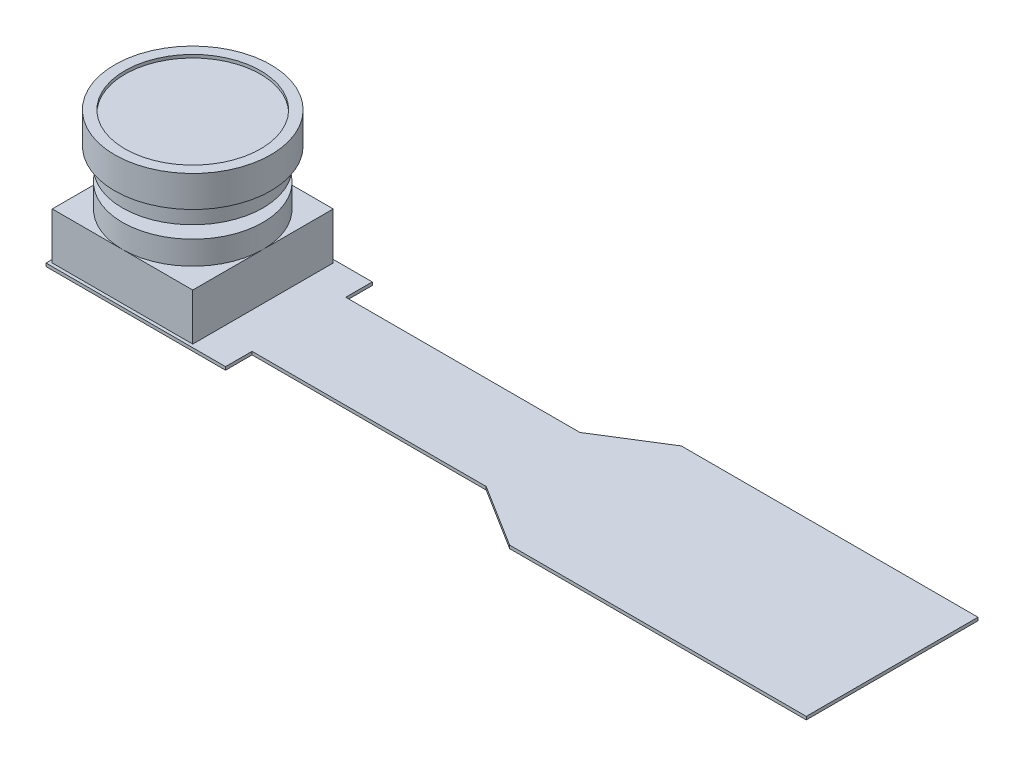
ISO-10303-21;
HEADER;
FILE_DESCRIPTION(('STEP AP214'),'2;1');
FILE_NAME('part.step','',(''),(''),'','','');
FILE_SCHEMA(('AUTOMOTIVE_DESIGN { 1 0 10303 214 1 1 1 1 }'));
ENDSEC;
DATA;
#1=APPLICATION_CONTEXT('core data for automotive mechanical design processes');
#2=APPLICATION_PROTOCOL_DEFINITION('international standard','automotive_design',2000,#1);
#3=PRODUCT_CONTEXT('',#1,'mechanical');
#4=PRODUCT('Part','Part','',(#3));
#5=PRODUCT_RELATED_PRODUCT_CATEGORY('part','',(#4));
#6=PRODUCT_DEFINITION_FORMATION('','',#4);
#7=PRODUCT_DEFINITION_CONTEXT('part definition',#1,'design');
#8=PRODUCT_DEFINITION('design','',#6,#7);
#9=PRODUCT_DEFINITION_SHAPE('','',#8);
#10=(LENGTH_UNIT() NAMED_UNIT(*) SI_UNIT(.MILLI.,.METRE.));
#11=(NAMED_UNIT(*) PLANE_ANGLE_UNIT() SI_UNIT($,.RADIAN.));
#12=(NAMED_UNIT(*) SI_UNIT($,.STERADIAN.) SOLID_ANGLE_UNIT());
#13=UNCERTAINTY_MEASURE_WITH_UNIT(LENGTH_MEASURE(1.E-05),#10,'distance_accuracy_value','');
#14=(GEOMETRIC_REPRESENTATION_CONTEXT(3) GLOBAL_UNCERTAINTY_ASSIGNED_CONTEXT((#13)) GLOBAL_UNIT_ASSIGNED_CONTEXT((#10,
#11,#12)) REPRESENTATION_CONTEXT('',''));
#15=CARTESIAN_POINT('',(0.,0.,0.));
#16=DIRECTION('',(0.,0.,1.));
#17=DIRECTION('',(1.,0.,0.));
#18=AXIS2_PLACEMENT_3D('',#15,#16,#17);
#19=CARTESIAN_POINT('',(0.,3.,0.));
#20=DIRECTION('',(0.,1.,0.));
#21=DIRECTION('',(0.,0.,1.));
#22=AXIS2_PLACEMENT_3D('',#19,#20,#21);
#23=PLANE('',#22);
#24=CARTESIAN_POINT('',(0.,3.,0.));
#25=DIRECTION('',(0.,1.,0.));
#26=DIRECTION('',(0.,0.,1.));
#27=AXIS2_PLACEMENT_3D('',#24,#25,#26);
#28=CIRCLE('',#27,4.5);
#29=CARTESIAN_POINT('',(0.,3.,4.5));
#30=VERTEX_POINT('',#29);
#31=CARTESIAN_POINT('',(4.5,3.,0.));
#32=VERTEX_POINT('',#31);
#33=EDGE_CURVE('E213',#30,#32,#28,.T.);
#34=ORIENTED_EDGE('',*,*,#33,.F.);
#35=DIRECTION('',(1.,0.,0.));
#36=VECTOR('',#35,1.);
#37=CARTESIAN_POINT('',(4.5,3.,4.5));
#38=LINE('',#37,#36);
#39=CARTESIAN_POINT('',(4.5,3.,4.5));
#40=VERTEX_POINT('',#39);
#41=EDGE_CURVE('E224',#30,#40,#38,.T.);
#42=ORIENTED_EDGE('',*,*,#41,.T.);
#43=DIRECTION('',(0.,0.,-1.));
#44=VECTOR('',#43,1.);
#45=CARTESIAN_POINT('',(4.5,3.,4.5));
#46=LINE('',#45,#44);
#47=EDGE_CURVE('E229',#40,#32,#46,.T.);
#48=ORIENTED_EDGE('',*,*,#47,.T.);
#49=EDGE_LOOP('',(#34,#42,#48));
#50=FACE_BOUND('',#49,.T.);
#51=ADVANCED_FACE('F35',(#50),#23,.T.);
#52=CARTESIAN_POINT('',(0.,3.,-4.5));
#53=VERTEX_POINT('',#52);
#54=EDGE_CURVE('E44',#32,#53,#28,.T.);
#55=ORIENTED_EDGE('',*,*,#54,.F.);
#56=CARTESIAN_POINT('',(4.5,3.,-4.5));
#57=VERTEX_POINT('',#56);
#58=EDGE_CURVE('E228',#32,#57,#46,.T.);
#59=ORIENTED_EDGE('',*,*,#58,.T.);
#60=DIRECTION('',(-1.,0.,0.));
#61=VECTOR('',#60,1.);
#62=CARTESIAN_POINT('',(4.5,3.,-4.5));
#63=LINE('',#62,#61);
#64=EDGE_CURVE('E233',#57,#53,#63,.T.);
#65=ORIENTED_EDGE('',*,*,#64,.T.);
#66=EDGE_LOOP('',(#55,#59,#65));
#67=FACE_BOUND('',#66,.T.);
#68=ADVANCED_FACE('F269',(#67),#23,.T.);
#69=CARTESIAN_POINT('',(-4.5,3.,0.));
#70=VERTEX_POINT('',#69);
#71=EDGE_CURVE('E52',#53,#70,#28,.T.);
#72=ORIENTED_EDGE('',*,*,#71,.F.);
#73=CARTESIAN_POINT('',(-4.5,3.,-4.5));
#74=VERTEX_POINT('',#73);
#75=EDGE_CURVE('E232',#53,#74,#63,.T.);
#76=ORIENTED_EDGE('',*,*,#75,.T.);
#77=DIRECTION('',(0.,0.,1.));
#78=VECTOR('',#77,1.);
#79=CARTESIAN_POINT('',(-4.5,3.,4.5));
#80=LINE('',#79,#78);
#81=EDGE_CURVE('E222',#74,#70,#80,.T.);
#82=ORIENTED_EDGE('',*,*,#81,.T.);
#83=EDGE_LOOP('',(#72,#76,#82));
#84=FACE_BOUND('',#83,.T.);
#85=ADVANCED_FACE('F274',(#84),#23,.T.);
#86=CARTESIAN_POINT('',(-4.5,3.,4.5));
#87=DIRECTION('',(1.,0.,0.));
#88=DIRECTION('',(0.,0.,-1.));
#89=AXIS2_PLACEMENT_3D('',#86,#87,#88);
#90=PLANE('',#89);
#91=DIRECTION('',(0.,0.,1.));
#92=VECTOR('',#91,1.);
#93=CARTESIAN_POINT('',(-4.5,0.,4.5));
#94=LINE('',#93,#92);
#95=CARTESIAN_POINT('',(-4.5,0.,-4.5));
#96=VERTEX_POINT('',#95);
#97=CARTESIAN_POINT('',(-4.5,0.,4.5));
#98=VERTEX_POINT('',#97);
#99=EDGE_CURVE('E218',#96,#98,#94,.T.);
#100=ORIENTED_EDGE('',*,*,#99,.T.);
#101=DIRECTION('',(0.,-1.,0.));
#102=VECTOR('',#101,1.);
#103=CARTESIAN_POINT('',(-4.5,3.,4.5));
#104=LINE('',#103,#102);
#105=CARTESIAN_POINT('',(-4.5,3.,4.5));
#106=VERTEX_POINT('',#105);
#107=EDGE_CURVE('E39',#106,#98,#104,.T.);
#108=ORIENTED_EDGE('',*,*,#107,.F.);
#109=EDGE_CURVE('E225',#70,#106,#80,.T.);
#110=ORIENTED_EDGE('',*,*,#109,.F.);
#111=ORIENTED_EDGE('',*,*,#81,.F.);
#112=DIRECTION('',(0.,-1.,0.));
#113=VECTOR('',#112,1.);
#114=CARTESIAN_POINT('',(-4.5,3.,-4.5));
#115=LINE('',#114,#113);
#116=EDGE_CURVE('E235',#74,#96,#115,.T.);
#117=ORIENTED_EDGE('',*,*,#116,.T.);
#118=EDGE_LOOP('',(#100,#108,#110,#111,#117));
#119=FACE_BOUND('',#118,.T.);
#120=ADVANCED_FACE('F37',(#119),#90,.F.);
#121=CARTESIAN_POINT('',(4.5,3.,4.5));
#122=DIRECTION('',(0.,0.,-1.));
#123=DIRECTION('',(-1.,0.,0.));
#124=AXIS2_PLACEMENT_3D('',#121,#122,#123);
#125=PLANE('',#124);
#126=DIRECTION('',(1.,0.,0.));
#127=VECTOR('',#126,1.);
#128=CARTESIAN_POINT('',(4.5,0.,4.5));
#129=LINE('',#128,#127);
#130=CARTESIAN_POINT('',(4.5,0.,4.5));
#131=VERTEX_POINT('',#130);
#132=EDGE_CURVE('E238',#98,#131,#129,.T.);
#133=ORIENTED_EDGE('',*,*,#132,.T.);
#134=DIRECTION('',(0.,-1.,0.));
#135=VECTOR('',#134,1.);
#136=CARTESIAN_POINT('',(4.5,3.,4.5));
#137=LINE('',#136,#135);
#138=EDGE_CURVE('E251',#40,#131,#137,.T.);
#139=ORIENTED_EDGE('',*,*,#138,.F.);
#140=ORIENTED_EDGE('',*,*,#41,.F.);
#141=EDGE_CURVE('E226',#106,#30,#38,.T.);
#142=ORIENTED_EDGE('',*,*,#141,.F.);
#143=ORIENTED_EDGE('',*,*,#107,.T.);
#144=EDGE_LOOP('',(#133,#139,#140,#142,#143));
#145=FACE_BOUND('',#144,.T.);
#146=ADVANCED_FACE('F279',(#145),#125,.F.);
#147=CARTESIAN_POINT('',(4.5,3.,4.5));
#148=DIRECTION('',(-1.,0.,0.));
#149=DIRECTION('',(0.,0.,1.));
#150=AXIS2_PLACEMENT_3D('',#147,#148,#149);
#151=PLANE('',#150);
#152=DIRECTION('',(0.,0.,-1.));
#153=VECTOR('',#152,1.);
#154=CARTESIAN_POINT('',(4.5,0.,4.5));
#155=LINE('',#154,#153);
#156=CARTESIAN_POINT('',(4.5,0.,-4.5));
#157=VERTEX_POINT('',#156);
#158=EDGE_CURVE('E241',#131,#157,#155,.T.);
#159=ORIENTED_EDGE('',*,*,#158,.T.);
#160=DIRECTION('',(0.,-1.,0.));
#161=VECTOR('',#160,1.);
#162=CARTESIAN_POINT('',(4.5,3.,-4.5));
#163=LINE('',#162,#161);
#164=EDGE_CURVE('E249',#57,#157,#163,.T.);
#165=ORIENTED_EDGE('',*,*,#164,.F.);
#166=ORIENTED_EDGE('',*,*,#58,.F.);
#167=ORIENTED_EDGE('',*,*,#47,.F.);
#168=ORIENTED_EDGE('',*,*,#138,.T.);
#169=EDGE_LOOP('',(#159,#165,#166,#167,#168));
#170=FACE_BOUND('',#169,.T.);
#171=ADVANCED_FACE('F266',(#170),#151,.F.);
#172=CARTESIAN_POINT('',(4.5,3.,-4.5));
#173=DIRECTION('',(0.,0.,1.));
#174=DIRECTION('',(1.,0.,0.));
#175=AXIS2_PLACEMENT_3D('',#172,#173,#174);
#176=PLANE('',#175);
#177=DIRECTION('',(-1.,0.,0.));
#178=VECTOR('',#177,1.);
#179=CARTESIAN_POINT('',(4.5,0.,-4.5));
#180=LINE('',#179,#178);
#181=EDGE_CURVE('E244',#157,#96,#180,.T.);
#182=ORIENTED_EDGE('',*,*,#181,.T.);
#183=ORIENTED_EDGE('',*,*,#116,.F.);
#184=ORIENTED_EDGE('',*,*,#75,.F.);
#185=ORIENTED_EDGE('',*,*,#64,.F.);
#186=ORIENTED_EDGE('',*,*,#164,.T.);
#187=EDGE_LOOP('',(#182,#183,#184,#185,#186));
#188=FACE_BOUND('',#187,.T.);
#189=ADVANCED_FACE('F271',(#188),#176,.F.);
#190=EDGE_CURVE('E221',#70,#30,#28,.T.);
#191=ORIENTED_EDGE('',*,*,#190,.F.);
#192=ORIENTED_EDGE('',*,*,#109,.T.);
#193=ORIENTED_EDGE('',*,*,#141,.T.);
#194=EDGE_LOOP('',(#191,#192,#193));
#195=FACE_BOUND('',#194,.T.);
#196=ADVANCED_FACE('F278',(#195),#23,.T.);
#197=CARTESIAN_POINT('',(0.,4.5,0.));
#198=DIRECTION('',(0.,-1.,0.));
#199=DIRECTION('',(0.,0.,-1.));
#200=AXIS2_PLACEMENT_3D('',#197,#198,#199);
#201=CYLINDRICAL_SURFACE('',#200,4.5);
#202=CARTESIAN_POINT('',(0.,4.5,0.));
#203=DIRECTION('',(0.,1.,0.));
#204=DIRECTION('',(0.,0.,1.));
#205=AXIS2_PLACEMENT_3D('',#202,#203,#204);
#206=CIRCLE('',#205,4.5);
#207=CARTESIAN_POINT('',(0.,4.5,4.5));
#208=VERTEX_POINT('',#207);
#209=EDGE_CURVE('E215',#208,#208,#206,.T.);
#210=ORIENTED_EDGE('',*,*,#209,.F.);
#211=EDGE_LOOP('',(#210));
#212=FACE_BOUND('',#211,.T.);
#213=ORIENTED_EDGE('',*,*,#33,.T.);
#214=ORIENTED_EDGE('',*,*,#54,.T.);
#215=ORIENTED_EDGE('',*,*,#71,.T.);
#216=ORIENTED_EDGE('',*,*,#190,.T.);
#217=EDGE_LOOP('',(#213,#214,#215,#216));
#218=FACE_BOUND('',#217,.T.);
#219=ADVANCED_FACE('F262',(#212,#218),#201,.T.);
#220=CARTESIAN_POINT('',(0.,4.5,0.));
#221=DIRECTION('',(0.,1.,0.));
#222=DIRECTION('',(0.,0.,1.));
#223=AXIS2_PLACEMENT_3D('',#220,#221,#222);
#224=PLANE('',#223);
#225=CARTESIAN_POINT('',(0.,4.5,0.));
#226=DIRECTION('',(0.,1.,0.));
#227=DIRECTION('',(0.,0.,1.));
#228=AXIS2_PLACEMENT_3D('',#225,#226,#227);
#229=CIRCLE('',#228,3.25);
#230=CARTESIAN_POINT('',(0.,4.5,3.25));
#231=VERTEX_POINT('',#230);
#232=EDGE_CURVE('E11',#231,#231,#229,.T.);
#233=ORIENTED_EDGE('',*,*,#232,.F.);
#234=EDGE_LOOP('',(#233));
#235=FACE_BOUND('',#234,.T.);
#236=ORIENTED_EDGE('',*,*,#209,.T.);
#237=EDGE_LOOP('',(#236));
#238=FACE_BOUND('',#237,.T.);
#239=ADVANCED_FACE('F402',(#235,#238),#224,.T.);
#240=CARTESIAN_POINT('',(0.,5.3,0.));
#241=DIRECTION('',(0.,-1.,0.));
#242=DIRECTION('',(0.,0.,-1.));
#243=AXIS2_PLACEMENT_3D('',#240,#241,#242);
#244=CYLINDRICAL_SURFACE('',#243,3.25);
#245=CARTESIAN_POINT('',(0.,5.3,0.));
#246=DIRECTION('',(0.,1.,0.));
#247=DIRECTION('',(0.,0.,1.));
#248=AXIS2_PLACEMENT_3D('',#245,#246,#247);
#249=CIRCLE('',#248,3.25);
#250=CARTESIAN_POINT('',(0.,5.3,3.25));
#251=VERTEX_POINT('',#250);
#252=EDGE_CURVE('E209',#251,#251,#249,.T.);
#253=ORIENTED_EDGE('',*,*,#252,.F.);
#254=EDGE_LOOP('',(#253));
#255=FACE_BOUND('',#254,.T.);
#256=ORIENTED_EDGE('',*,*,#232,.T.);
#257=EDGE_LOOP('',(#256));
#258=FACE_BOUND('',#257,.T.);
#259=ADVANCED_FACE('F565',(#255,#258),#244,.T.);
#260=CARTESIAN_POINT('',(0.,6.5,0.));
#261=DIRECTION('',(0.,-1.,0.));
#262=DIRECTION('',(0.,0.,-1.));
#263=AXIS2_PLACEMENT_3D('',#260,#261,#262);
#264=CYLINDRICAL_SURFACE('',#263,4.5);
#265=CARTESIAN_POINT('',(0.,6.5,0.));
#266=DIRECTION('',(0.,1.,0.));
#267=DIRECTION('',(0.,0.,1.));
#268=AXIS2_PLACEMENT_3D('',#265,#266,#267);
#269=CIRCLE('',#268,4.5);
#270=CARTESIAN_POINT('',(0.,6.5,4.5));
#271=VERTEX_POINT('',#270);
#272=EDGE_CURVE('E206',#271,#271,#269,.T.);
#273=ORIENTED_EDGE('',*,*,#272,.F.);
#274=EDGE_LOOP('',(#273));
#275=FACE_BOUND('',#274,.T.);
#276=CARTESIAN_POINT('',(0.,5.3,0.));
#277=DIRECTION('',(0.,1.,0.));
#278=DIRECTION('',(0.,0.,1.));
#279=AXIS2_PLACEMENT_3D('',#276,#277,#278);
#280=CIRCLE('',#279,4.5);
#281=CARTESIAN_POINT('',(0.,5.3,4.5));
#282=VERTEX_POINT('',#281);
#283=EDGE_CURVE('E203',#282,#282,#280,.T.);
#284=ORIENTED_EDGE('',*,*,#283,.T.);
#285=EDGE_LOOP('',(#284));
#286=FACE_BOUND('',#285,.T.);
#287=ADVANCED_FACE('F561',(#275,#286),#264,.T.);
#288=CARTESIAN_POINT('',(0.,5.3,0.));
#289=DIRECTION('',(0.,1.,0.));
#290=DIRECTION('',(0.,0.,1.));
#291=AXIS2_PLACEMENT_3D('',#288,#289,#290);
#292=PLANE('',#291);
#293=ORIENTED_EDGE('',*,*,#252,.T.);
#294=EDGE_LOOP('',(#293));
#295=FACE_BOUND('',#294,.T.);
#296=ORIENTED_EDGE('',*,*,#283,.F.);
#297=EDGE_LOOP('',(#296));
#298=FACE_BOUND('',#297,.T.);
#299=ADVANCED_FACE('F557',(#295,#298),#292,.F.);
#300=CARTESIAN_POINT('',(0.,8.5,0.));
#301=DIRECTION('',(0.,-1.,0.));
#302=DIRECTION('',(0.,0.,-1.));
#303=AXIS2_PLACEMENT_3D('',#300,#301,#302);
#304=CYLINDRICAL_SURFACE('',#303,5.);
#305=CARTESIAN_POINT('',(0.,8.5,0.));
#306=DIRECTION('',(0.,1.,0.));
#307=DIRECTION('',(0.,0.,1.));
#308=AXIS2_PLACEMENT_3D('',#305,#306,#307);
#309=CIRCLE('',#308,5.);
#310=CARTESIAN_POINT('',(0.,8.5,5.));
#311=VERTEX_POINT('',#310);
#312=EDGE_CURVE('E200',#311,#311,#309,.T.);
#313=ORIENTED_EDGE('',*,*,#312,.F.);
#314=EDGE_LOOP('',(#313));
#315=FACE_BOUND('',#314,.T.);
#316=CARTESIAN_POINT('',(0.,6.5,0.));
#317=DIRECTION('',(0.,1.,0.));
#318=DIRECTION('',(0.,0.,1.));
#319=AXIS2_PLACEMENT_3D('',#316,#317,#318);
#320=CIRCLE('',#319,5.);
#321=CARTESIAN_POINT('',(0.,6.5,5.));
#322=VERTEX_POINT('',#321);
#323=EDGE_CURVE('E198',#322,#322,#320,.T.);
#324=ORIENTED_EDGE('',*,*,#323,.T.);
#325=EDGE_LOOP('',(#324));
#326=FACE_BOUND('',#325,.T.);
#327=ADVANCED_FACE('F550',(#315,#326),#304,.T.);
#328=CARTESIAN_POINT('',(0.,8.5,0.));
#329=DIRECTION('',(0.,1.,0.));
#330=DIRECTION('',(0.,0.,1.));
#331=AXIS2_PLACEMENT_3D('',#328,#329,#330);
#332=PLANE('',#331);
#333=CARTESIAN_POINT('',(0.,8.5,0.));
#334=DIRECTION('',(0.,1.,0.));
#335=DIRECTION('',(0.,0.,1.));
#336=AXIS2_PLACEMENT_3D('',#333,#334,#335);
#337=CIRCLE('',#336,4.34490158710362);
#338=CARTESIAN_POINT('',(0.,8.5,4.34490158710362));
#339=VERTEX_POINT('',#338);
#340=EDGE_CURVE('E188',#339,#339,#337,.T.);
#341=ORIENTED_EDGE('',*,*,#340,.F.);
#342=EDGE_LOOP('',(#341));
#343=FACE_BOUND('',#342,.T.);
#344=ORIENTED_EDGE('',*,*,#312,.T.);
#345=EDGE_LOOP('',(#344));
#346=FACE_BOUND('',#345,.T.);
#347=ADVANCED_FACE('F547',(#343,#346),#332,.T.);
#348=CARTESIAN_POINT('',(0.,6.5,0.));
#349=DIRECTION('',(0.,1.,0.));
#350=DIRECTION('',(0.,0.,1.));
#351=AXIS2_PLACEMENT_3D('',#348,#349,#350);
#352=PLANE('',#351);
#353=ORIENTED_EDGE('',*,*,#272,.T.);
#354=EDGE_LOOP('',(#353));
#355=FACE_BOUND('',#354,.T.);
#356=ORIENTED_EDGE('',*,*,#323,.F.);
#357=EDGE_LOOP('',(#356));
#358=FACE_BOUND('',#357,.T.);
#359=ADVANCED_FACE('F545',(#355,#358),#352,.F.);
#360=CARTESIAN_POINT('',(0.,8.3,0.));
#361=DIRECTION('',(0.,1.,0.));
#362=DIRECTION('',(0.,0.,1.));
#363=AXIS2_PLACEMENT_3D('',#360,#361,#362);
#364=CYLINDRICAL_SURFACE('',#363,4.34490158710362);
#365=CARTESIAN_POINT('',(0.,8.3,0.));
#366=DIRECTION('',(0.,1.,0.));
#367=DIRECTION('',(0.,0.,1.));
#368=AXIS2_PLACEMENT_3D('',#365,#366,#367);
#369=CIRCLE('',#368,4.34490158710362);
#370=CARTESIAN_POINT('',(0.,8.3,4.34490158710362));
#371=VERTEX_POINT('',#370);
#372=EDGE_CURVE('E191',#371,#371,#369,.T.);
#373=ORIENTED_EDGE('',*,*,#372,.F.);
#374=EDGE_LOOP('',(#373));
#375=FACE_BOUND('',#374,.T.);
#376=ORIENTED_EDGE('',*,*,#340,.T.);
#377=EDGE_LOOP('',(#376));
#378=FACE_BOUND('',#377,.T.);
#379=ADVANCED_FACE('F541',(#375,#378),#364,.F.);
#380=CARTESIAN_POINT('',(0.,8.3,0.));
#381=DIRECTION('',(0.,1.,0.));
#382=DIRECTION('',(0.,0.,1.));
#383=AXIS2_PLACEMENT_3D('',#380,#381,#382);
#384=PLANE('',#383);
#385=ORIENTED_EDGE('',*,*,#372,.T.);
#386=EDGE_LOOP('',(#385));
#387=FACE_BOUND('',#386,.T.);
#388=ADVANCED_FACE('F431',(#387),#384,.T.);
#389=CARTESIAN_POINT('',(-4.7,-0.2,4.7));
#390=DIRECTION('',(1.,0.,0.));
#391=DIRECTION('',(0.,0.,-1.));
#392=AXIS2_PLACEMENT_3D('',#389,#390,#391);
#393=PLANE('',#392);
#394=DIRECTION('',(0.,0.,-1.));
#395=VECTOR('',#394,1.);
#396=CARTESIAN_POINT('',(-4.7,0.,4.7));
#397=LINE('',#396,#395);
#398=CARTESIAN_POINT('',(-4.7,0.,4.7));
#399=VERTEX_POINT('',#398);
#400=CARTESIAN_POINT('',(-4.7,0.,-4.7));
#401=VERTEX_POINT('',#400);
#402=EDGE_CURVE('E187',#399,#401,#397,.T.);
#403=ORIENTED_EDGE('',*,*,#402,.T.);
#404=DIRECTION('',(0.,1.,0.));
#405=VECTOR('',#404,1.);
#406=CARTESIAN_POINT('',(-4.7,-0.2,-4.7));
#407=LINE('',#406,#405);
#408=CARTESIAN_POINT('',(-4.7,-0.2,-4.7));
#409=VERTEX_POINT('',#408);
#410=EDGE_CURVE('E167',#409,#401,#407,.T.);
#411=ORIENTED_EDGE('',*,*,#410,.F.);
#412=DIRECTION('',(0.,0.,-1.));
#413=VECTOR('',#412,1.);
#414=CARTESIAN_POINT('',(-4.7,-0.2,4.7));
#415=LINE('',#414,#413);
#416=CARTESIAN_POINT('',(-4.7,-0.2,4.7));
#417=VERTEX_POINT('',#416);
#418=EDGE_CURVE('E174',#417,#409,#415,.T.);
#419=ORIENTED_EDGE('',*,*,#418,.F.);
#420=DIRECTION('',(0.,1.,0.));
#421=VECTOR('',#420,1.);
#422=CARTESIAN_POINT('',(-4.7,-0.2,4.7));
#423=LINE('',#422,#421);
#424=EDGE_CURVE('E313',#417,#399,#423,.T.);
#425=ORIENTED_EDGE('',*,*,#424,.T.);
#426=EDGE_LOOP('',(#403,#411,#419,#425));
#427=FACE_BOUND('',#426,.T.);
#428=ADVANCED_FACE('F185',(#427),#393,.F.);
#429=CARTESIAN_POINT('',(-4.7,-0.2,-4.7));
#430=DIRECTION('',(0.,0.,1.));
#431=DIRECTION('',(1.,0.,0.));
#432=AXIS2_PLACEMENT_3D('',#429,#430,#431);
#433=PLANE('',#432);
#434=DIRECTION('',(1.,0.,0.));
#435=VECTOR('',#434,1.);
#436=CARTESIAN_POINT('',(-4.7,0.,-4.7));
#437=LINE('',#436,#435);
#438=CARTESIAN_POINT('',(6.8,0.,-4.7));
#439=VERTEX_POINT('',#438);
#440=EDGE_CURVE('E288',#401,#439,#437,.T.);
#441=ORIENTED_EDGE('',*,*,#440,.T.);
#442=DIRECTION('',(0.,1.,0.));
#443=VECTOR('',#442,1.);
#444=CARTESIAN_POINT('',(6.8,-0.2,-4.7));
#445=LINE('',#444,#443);
#446=CARTESIAN_POINT('',(6.8,-0.2,-4.7));
#447=VERTEX_POINT('',#446);
#448=EDGE_CURVE('E170',#447,#439,#445,.T.);
#449=ORIENTED_EDGE('',*,*,#448,.F.);
#450=DIRECTION('',(1.,0.,0.));
#451=VECTOR('',#450,1.);
#452=CARTESIAN_POINT('',(-4.7,-0.2,-4.7));
#453=LINE('',#452,#451);
#454=EDGE_CURVE('E163',#409,#447,#453,.T.);
#455=ORIENTED_EDGE('',*,*,#454,.F.);
#456=ORIENTED_EDGE('',*,*,#410,.T.);
#457=EDGE_LOOP('',(#441,#449,#455,#456));
#458=FACE_BOUND('',#457,.T.);
#459=ADVANCED_FACE('F165',(#458),#433,.F.);
#460=CARTESIAN_POINT('',(6.8,-0.2,-4.7));
#461=DIRECTION('',(-1.,0.,0.));
#462=DIRECTION('',(0.,0.,1.));
#463=AXIS2_PLACEMENT_3D('',#460,#461,#462);
#464=PLANE('',#463);
#465=DIRECTION('',(0.,0.,1.));
#466=VECTOR('',#465,1.);
#467=CARTESIAN_POINT('',(6.8,0.,-4.7));
#468=LINE('',#467,#466);
#469=CARTESIAN_POINT('',(6.8,0.,-3.));
#470=VERTEX_POINT('',#469);
#471=EDGE_CURVE('E290',#439,#470,#468,.T.);
#472=ORIENTED_EDGE('',*,*,#471,.T.);
#473=DIRECTION('',(0.,1.,0.));
#474=VECTOR('',#473,1.);
#475=CARTESIAN_POINT('',(6.8,-0.2,-3.));
#476=LINE('',#475,#474);
#477=CARTESIAN_POINT('',(6.8,-0.2,-3.));
#478=VERTEX_POINT('',#477);
#479=EDGE_CURVE('E193',#478,#470,#476,.T.);
#480=ORIENTED_EDGE('',*,*,#479,.F.);
#481=DIRECTION('',(0.,0.,1.));
#482=VECTOR('',#481,1.);
#483=CARTESIAN_POINT('',(6.8,-0.2,-4.7));
#484=LINE('',#483,#482);
#485=EDGE_CURVE('E173',#447,#478,#484,.T.);
#486=ORIENTED_EDGE('',*,*,#485,.F.);
#487=ORIENTED_EDGE('',*,*,#448,.T.);
#488=EDGE_LOOP('',(#472,#480,#486,#487));
#489=FACE_BOUND('',#488,.T.);
#490=ADVANCED_FACE('F442',(#489),#464,.F.);
#491=CARTESIAN_POINT('',(6.8,-0.2,-3.));
#492=DIRECTION('',(0.,0.,1.));
#493=DIRECTION('',(1.,0.,0.));
#494=AXIS2_PLACEMENT_3D('',#491,#492,#493);
#495=PLANE('',#494);
#496=DIRECTION('',(1.,0.,0.));
#497=VECTOR('',#496,1.);
#498=CARTESIAN_POINT('',(6.8,0.,-3.));
#499=LINE('',#498,#497);
#500=CARTESIAN_POINT('',(21.8,0.,-3.));
#501=VERTEX_POINT('',#500);
#502=EDGE_CURVE('E296',#470,#501,#499,.T.);
#503=ORIENTED_EDGE('',*,*,#502,.T.);
#504=DIRECTION('',(0.,1.,0.));
#505=VECTOR('',#504,1.);
#506=CARTESIAN_POINT('',(21.8,-0.2,-3.));
#507=LINE('',#506,#505);
#508=CARTESIAN_POINT('',(21.8,-0.2,-3.));
#509=VERTEX_POINT('',#508);
#510=EDGE_CURVE('E336',#509,#501,#507,.T.);
#511=ORIENTED_EDGE('',*,*,#510,.F.);
#512=DIRECTION('',(1.,0.,0.));
#513=VECTOR('',#512,1.);
#514=CARTESIAN_POINT('',(6.8,-0.2,-3.));
#515=LINE('',#514,#513);
#516=EDGE_CURVE('E345',#478,#509,#515,.T.);
#517=ORIENTED_EDGE('',*,*,#516,.F.);
#518=ORIENTED_EDGE('',*,*,#479,.T.);
#519=EDGE_LOOP('',(#503,#511,#517,#518));
#520=FACE_BOUND('',#519,.T.);
#521=ADVANCED_FACE('F343',(#520),#495,.F.);
#522=CARTESIAN_POINT('',(21.8,-0.2,-3.));
#523=DIRECTION('',(0.52999894000318,0.,0.847998304005088));
#524=DIRECTION('',(0.847998304005088,0.,-0.52999894000318));
#525=AXIS2_PLACEMENT_3D('',#522,#523,#524);
#526=PLANE('',#525);
#527=DIRECTION('',(0.847998304005088,0.,-0.52999894000318));
#528=VECTOR('',#527,1.);
#529=CARTESIAN_POINT('',(21.8,0.,-3.));
#530=LINE('',#529,#528);
#531=CARTESIAN_POINT('',(25.8,0.,-5.5));
#532=VERTEX_POINT('',#531);
#533=EDGE_CURVE('E298',#501,#532,#530,.T.);
#534=ORIENTED_EDGE('',*,*,#533,.T.);
#535=DIRECTION('',(0.,1.,0.));
#536=VECTOR('',#535,1.);
#537=CARTESIAN_POINT('',(25.8,-0.2,-5.5));
#538=LINE('',#537,#536);
#539=CARTESIAN_POINT('',(25.8,-0.2,-5.5));
#540=VERTEX_POINT('',#539);
#541=EDGE_CURVE('E333',#540,#532,#538,.T.);
#542=ORIENTED_EDGE('',*,*,#541,.F.);
#543=DIRECTION('',(0.847998304005088,0.,-0.52999894000318));
#544=VECTOR('',#543,1.);
#545=CARTESIAN_POINT('',(21.8,-0.2,-3.));
#546=LINE('',#545,#544);
#547=EDGE_CURVE('E361',#509,#540,#546,.T.);
#548=ORIENTED_EDGE('',*,*,#547,.F.);
#549=ORIENTED_EDGE('',*,*,#510,.T.);
#550=EDGE_LOOP('',(#534,#542,#548,#549));
#551=FACE_BOUND('',#550,.T.);
#552=ADVANCED_FACE('F352',(#551),#526,.F.);
#553=CARTESIAN_POINT('',(25.8,-0.2,-5.5));
#554=DIRECTION('',(0.,0.,1.));
#555=DIRECTION('',(1.,0.,0.));
#556=AXIS2_PLACEMENT_3D('',#553,#554,#555);
#557=PLANE('',#556);
#558=DIRECTION('',(1.,0.,0.));
#559=VECTOR('',#558,1.);
#560=CARTESIAN_POINT('',(25.8,0.,-5.5));
#561=LINE('',#560,#559);
#562=CARTESIAN_POINT('',(44.8,0.,-5.5));
#563=VERTEX_POINT('',#562);
#564=EDGE_CURVE('E300',#532,#563,#561,.T.);
#565=ORIENTED_EDGE('',*,*,#564,.T.);
#566=DIRECTION('',(0.,1.,0.));
#567=VECTOR('',#566,1.);
#568=CARTESIAN_POINT('',(44.8,-0.2,-5.5));
#569=LINE('',#568,#567);
#570=CARTESIAN_POINT('',(44.8,-0.2,-5.5));
#571=VERTEX_POINT('',#570);
#572=EDGE_CURVE('E330',#571,#563,#569,.T.);
#573=ORIENTED_EDGE('',*,*,#572,.F.);
#574=DIRECTION('',(1.,0.,0.));
#575=VECTOR('',#574,1.);
#576=CARTESIAN_POINT('',(25.8,-0.2,-5.5));
#577=LINE('',#576,#575);
#578=EDGE_CURVE('E358',#540,#571,#577,.T.);
#579=ORIENTED_EDGE('',*,*,#578,.F.);
#580=ORIENTED_EDGE('',*,*,#541,.T.);
#581=EDGE_LOOP('',(#565,#573,#579,#580));
#582=FACE_BOUND('',#581,.T.);
#583=ADVANCED_FACE('F356',(#582),#557,.F.);
#584=CARTESIAN_POINT('',(44.8,-0.2,5.5));
#585=DIRECTION('',(-1.,0.,0.));
#586=DIRECTION('',(0.,0.,1.));
#587=AXIS2_PLACEMENT_3D('',#584,#585,#586);
#588=PLANE('',#587);
#589=DIRECTION('',(0.,0.,1.));
#590=VECTOR('',#589,1.);
#591=CARTESIAN_POINT('',(44.8,0.,5.5));
#592=LINE('',#591,#590);
#593=CARTESIAN_POINT('',(44.8,0.,5.5));
#594=VERTEX_POINT('',#593);
#595=EDGE_CURVE('E302',#563,#594,#592,.T.);
#596=ORIENTED_EDGE('',*,*,#595,.T.);
#597=DIRECTION('',(0.,1.,0.));
#598=VECTOR('',#597,1.);
#599=CARTESIAN_POINT('',(44.8,-0.2,5.5));
#600=LINE('',#599,#598);
#601=CARTESIAN_POINT('',(44.8,-0.2,5.5));
#602=VERTEX_POINT('',#601);
#603=EDGE_CURVE('E327',#602,#594,#600,.T.);
#604=ORIENTED_EDGE('',*,*,#603,.F.);
#605=DIRECTION('',(0.,0.,1.));
#606=VECTOR('',#605,1.);
#607=CARTESIAN_POINT('',(44.8,-0.2,5.5));
#608=LINE('',#607,#606);
#609=EDGE_CURVE('E360',#571,#602,#608,.T.);
#610=ORIENTED_EDGE('',*,*,#609,.F.);
#611=ORIENTED_EDGE('',*,*,#572,.T.);
#612=EDGE_LOOP('',(#596,#604,#610,#611));
#613=FACE_BOUND('',#612,.T.);
#614=ADVANCED_FACE('F475',(#613),#588,.F.);
#615=CARTESIAN_POINT('',(25.8,-0.2,5.5));
#616=DIRECTION('',(0.,0.,-1.));
#617=DIRECTION('',(-1.,0.,0.));
#618=AXIS2_PLACEMENT_3D('',#615,#616,#617);
#619=PLANE('',#618);
#620=DIRECTION('',(-1.,0.,0.));
#621=VECTOR('',#620,1.);
#622=CARTESIAN_POINT('',(25.8,0.,5.5));
#623=LINE('',#622,#621);
#624=CARTESIAN_POINT('',(25.8,0.,5.5));
#625=VERTEX_POINT('',#624);
#626=EDGE_CURVE('E304',#594,#625,#623,.T.);
#627=ORIENTED_EDGE('',*,*,#626,.T.);
#628=DIRECTION('',(0.,1.,0.));
#629=VECTOR('',#628,1.);
#630=CARTESIAN_POINT('',(25.8,-0.2,5.5));
#631=LINE('',#630,#629);
#632=CARTESIAN_POINT('',(25.8,-0.2,5.5));
#633=VERTEX_POINT('',#632);
#634=EDGE_CURVE('E324',#633,#625,#631,.T.);
#635=ORIENTED_EDGE('',*,*,#634,.F.);
#636=DIRECTION('',(-1.,0.,0.));
#637=VECTOR('',#636,1.);
#638=CARTESIAN_POINT('',(25.8,-0.2,5.5));
#639=LINE('',#638,#637);
#640=EDGE_CURVE('E363',#602,#633,#639,.T.);
#641=ORIENTED_EDGE('',*,*,#640,.F.);
#642=ORIENTED_EDGE('',*,*,#603,.T.);
#643=EDGE_LOOP('',(#627,#635,#641,#642));
#644=FACE_BOUND('',#643,.T.);
#645=ADVANCED_FACE('F484',(#644),#619,.F.);
#646=CARTESIAN_POINT('',(21.8,-0.2,3.));
#647=DIRECTION('',(0.52999894000318,0.,-0.847998304005088));
#648=DIRECTION('',(-0.847998304005088,0.,-0.52999894000318));
#649=AXIS2_PLACEMENT_3D('',#646,#647,#648);
#650=PLANE('',#649);
#651=DIRECTION('',(-0.847998304005088,0.,-0.52999894000318));
#652=VECTOR('',#651,1.);
#653=CARTESIAN_POINT('',(21.8,0.,3.));
#654=LINE('',#653,#652);
#655=CARTESIAN_POINT('',(21.8,0.,3.));
#656=VERTEX_POINT('',#655);
#657=EDGE_CURVE('E306',#625,#656,#654,.T.);
#658=ORIENTED_EDGE('',*,*,#657,.T.);
#659=DIRECTION('',(0.,1.,0.));
#660=VECTOR('',#659,1.);
#661=CARTESIAN_POINT('',(21.8,-0.2,3.));
#662=LINE('',#661,#660);
#663=CARTESIAN_POINT('',(21.8,-0.2,3.));
#664=VERTEX_POINT('',#663);
#665=EDGE_CURVE('E321',#664,#656,#662,.T.);
#666=ORIENTED_EDGE('',*,*,#665,.F.);
#667=DIRECTION('',(-0.847998304005088,0.,-0.52999894000318));
#668=VECTOR('',#667,1.);
#669=CARTESIAN_POINT('',(21.8,-0.2,3.));
#670=LINE('',#669,#668);
#671=EDGE_CURVE('E369',#633,#664,#670,.T.);
#672=ORIENTED_EDGE('',*,*,#671,.F.);
#673=ORIENTED_EDGE('',*,*,#634,.T.);
#674=EDGE_LOOP('',(#658,#666,#672,#673));
#675=FACE_BOUND('',#674,.T.);
#676=ADVANCED_FACE('F494',(#675),#650,.F.);
#677=CARTESIAN_POINT('',(6.8,-0.2,3.));
#678=DIRECTION('',(0.,0.,-1.));
#679=DIRECTION('',(-1.,0.,0.));
#680=AXIS2_PLACEMENT_3D('',#677,#678,#679);
#681=PLANE('',#680);
#682=DIRECTION('',(-1.,0.,0.));
#683=VECTOR('',#682,1.);
#684=CARTESIAN_POINT('',(6.8,0.,3.));
#685=LINE('',#684,#683);
#686=CARTESIAN_POINT('',(6.8,0.,3.));
#687=VERTEX_POINT('',#686);
#688=EDGE_CURVE('E308',#656,#687,#685,.T.);
#689=ORIENTED_EDGE('',*,*,#688,.T.);
#690=DIRECTION('',(0.,1.,0.));
#691=VECTOR('',#690,1.);
#692=CARTESIAN_POINT('',(6.8,-0.2,3.));
#693=LINE('',#692,#691);
#694=CARTESIAN_POINT('',(6.8,-0.2,3.));
#695=VERTEX_POINT('',#694);
#696=EDGE_CURVE('E318',#695,#687,#693,.T.);
#697=ORIENTED_EDGE('',*,*,#696,.F.);
#698=DIRECTION('',(-1.,0.,0.));
#699=VECTOR('',#698,1.);
#700=CARTESIAN_POINT('',(6.8,-0.2,3.));
#701=LINE('',#700,#699);
#702=EDGE_CURVE('E371',#664,#695,#701,.T.);
#703=ORIENTED_EDGE('',*,*,#702,.F.);
#704=ORIENTED_EDGE('',*,*,#665,.T.);
#705=EDGE_LOOP('',(#689,#697,#703,#704));
#706=FACE_BOUND('',#705,.T.);
#707=ADVANCED_FACE('F388',(#706),#681,.F.);
#708=CARTESIAN_POINT('',(6.8,-0.2,4.7));
#709=DIRECTION('',(-1.,0.,0.));
#710=DIRECTION('',(0.,0.,1.));
#711=AXIS2_PLACEMENT_3D('',#708,#709,#710);
#712=PLANE('',#711);
#713=DIRECTION('',(0.,0.,1.));
#714=VECTOR('',#713,1.);
#715=CARTESIAN_POINT('',(6.8,0.,4.7));
#716=LINE('',#715,#714);
#717=CARTESIAN_POINT('',(6.8,0.,4.7));
#718=VERTEX_POINT('',#717);
#719=EDGE_CURVE('E310',#687,#718,#716,.T.);
#720=ORIENTED_EDGE('',*,*,#719,.T.);
#721=DIRECTION('',(0.,1.,0.));
#722=VECTOR('',#721,1.);
#723=CARTESIAN_POINT('',(6.8,-0.2,4.7));
#724=LINE('',#723,#722);
#725=CARTESIAN_POINT('',(6.8,-0.2,4.7));
#726=VERTEX_POINT('',#725);
#727=EDGE_CURVE('E315',#726,#718,#724,.T.);
#728=ORIENTED_EDGE('',*,*,#727,.F.);
#729=DIRECTION('',(0.,0.,1.));
#730=VECTOR('',#729,1.);
#731=CARTESIAN_POINT('',(6.8,-0.2,4.7));
#732=LINE('',#731,#730);
#733=EDGE_CURVE('E372',#695,#726,#732,.T.);
#734=ORIENTED_EDGE('',*,*,#733,.F.);
#735=ORIENTED_EDGE('',*,*,#696,.T.);
#736=EDGE_LOOP('',(#720,#728,#734,#735));
#737=FACE_BOUND('',#736,.T.);
#738=ADVANCED_FACE('F378',(#737),#712,.F.);
#739=CARTESIAN_POINT('',(-4.7,-0.2,4.7));
#740=DIRECTION('',(0.,0.,-1.));
#741=DIRECTION('',(-1.,0.,0.));
#742=AXIS2_PLACEMENT_3D('',#739,#740,#741);
#743=PLANE('',#742);
#744=DIRECTION('',(-1.,0.,0.));
#745=VECTOR('',#744,1.);
#746=CARTESIAN_POINT('',(-4.7,0.,4.7));
#747=LINE('',#746,#745);
#748=EDGE_CURVE('E183',#718,#399,#747,.T.);
#749=ORIENTED_EDGE('',*,*,#748,.T.);
#750=ORIENTED_EDGE('',*,*,#424,.F.);
#751=DIRECTION('',(-1.,0.,0.));
#752=VECTOR('',#751,1.);
#753=CARTESIAN_POINT('',(-4.7,-0.2,4.7));
#754=LINE('',#753,#752);
#755=EDGE_CURVE('E179',#726,#417,#754,.T.);
#756=ORIENTED_EDGE('',*,*,#755,.F.);
#757=ORIENTED_EDGE('',*,*,#727,.T.);
#758=EDGE_LOOP('',(#749,#750,#756,#757));
#759=FACE_BOUND('',#758,.T.);
#760=ADVANCED_FACE('F380',(#759),#743,.F.);
#761=CARTESIAN_POINT('',(0.,-0.2,0.));
#762=DIRECTION('',(0.,-1.,0.));
#763=DIRECTION('',(0.,0.,-1.));
#764=AXIS2_PLACEMENT_3D('',#761,#762,#763);
#765=PLANE('',#764);
#766=ORIENTED_EDGE('',*,*,#418,.T.);
#767=ORIENTED_EDGE('',*,*,#454,.T.);
#768=ORIENTED_EDGE('',*,*,#485,.T.);
#769=ORIENTED_EDGE('',*,*,#516,.T.);
#770=ORIENTED_EDGE('',*,*,#547,.T.);
#771=ORIENTED_EDGE('',*,*,#578,.T.);
#772=ORIENTED_EDGE('',*,*,#609,.T.);
#773=ORIENTED_EDGE('',*,*,#640,.T.);
#774=ORIENTED_EDGE('',*,*,#671,.T.);
#775=ORIENTED_EDGE('',*,*,#702,.T.);
#776=ORIENTED_EDGE('',*,*,#733,.T.);
#777=ORIENTED_EDGE('',*,*,#755,.T.);
#778=EDGE_LOOP('',(#766,#767,#768,#769,#770,#771,#772,#773,#774,#775,#776,#777));
#779=FACE_BOUND('',#778,.T.);
#780=ADVANCED_FACE('F177',(#779),#765,.T.);
#781=CARTESIAN_POINT('',(0.,0.,0.));
#782=DIRECTION('',(0.,-1.,0.));
#783=DIRECTION('',(0.,0.,-1.));
#784=AXIS2_PLACEMENT_3D('',#781,#782,#783);
#785=PLANE('',#784);
#786=ORIENTED_EDGE('',*,*,#99,.F.);
#787=ORIENTED_EDGE('',*,*,#181,.F.);
#788=ORIENTED_EDGE('',*,*,#158,.F.);
#789=ORIENTED_EDGE('',*,*,#132,.F.);
#790=EDGE_LOOP('',(#786,#787,#788,#789));
#791=FACE_BOUND('',#790,.T.);
#792=ORIENTED_EDGE('',*,*,#402,.F.);
#793=ORIENTED_EDGE('',*,*,#748,.F.);
#794=ORIENTED_EDGE('',*,*,#719,.F.);
#795=ORIENTED_EDGE('',*,*,#688,.F.);
#796=ORIENTED_EDGE('',*,*,#657,.F.);
#797=ORIENTED_EDGE('',*,*,#626,.F.);
#798=ORIENTED_EDGE('',*,*,#595,.F.);
#799=ORIENTED_EDGE('',*,*,#564,.F.);
#800=ORIENTED_EDGE('',*,*,#533,.F.);
#801=ORIENTED_EDGE('',*,*,#502,.F.);
#802=ORIENTED_EDGE('',*,*,#471,.F.);
#803=ORIENTED_EDGE('',*,*,#440,.F.);
#804=EDGE_LOOP('',(#792,#793,#794,#795,#796,#797,#798,#799,#800,#801,#802,#803));
#805=FACE_BOUND('',#804,.T.);
#806=ADVANCED_FACE('F281',(#791,#805),#785,.F.);
#807=CLOSED_SHELL('',(#51,#68,#85,#120,#146,#171,#189,#196,#219,#239,#259,#287,#299,#327,#347,
#359,#379,#388,#428,#459,#490,#521,#552,#583,#614,#645,#676,#707,#738,#760,#780,#806));
#808=MANIFOLD_SOLID_BREP('B2',#807);
#809=ADVANCED_BREP_SHAPE_REPRESENTATION('',(#18,#808),#14);
#810=SHAPE_DEFINITION_REPRESENTATION(#9,#809);
ENDSEC;
END-ISO-10303-21;
